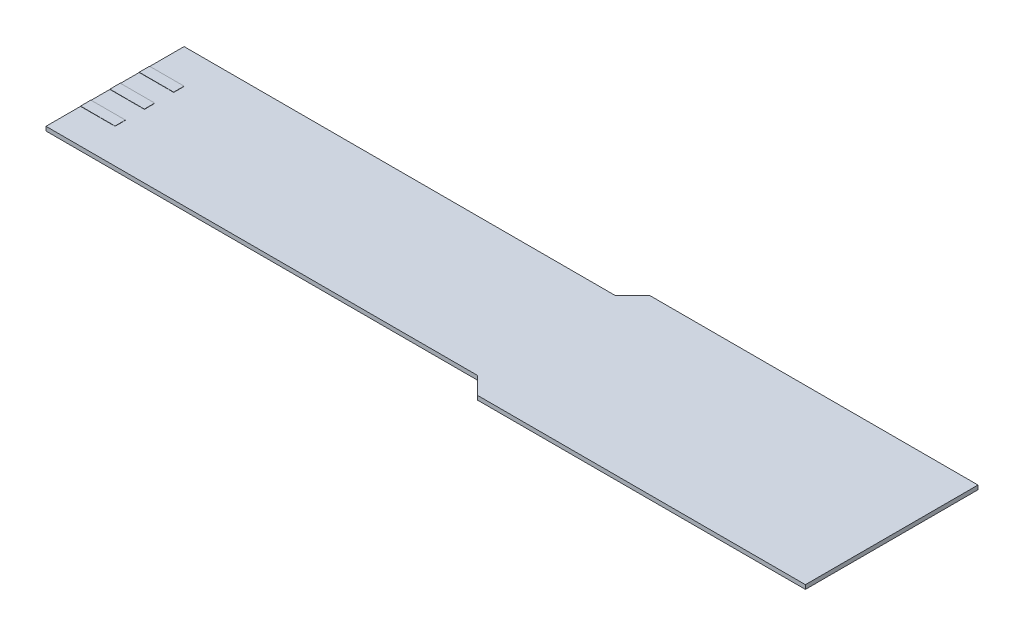
ISO-10303-21;
HEADER;
FILE_DESCRIPTION(('STEP AP214'),'2;1');
FILE_NAME('part.step','',(''),(''),'','','');
FILE_SCHEMA(('AUTOMOTIVE_DESIGN { 1 0 10303 214 1 1 1 1 }'));
ENDSEC;
DATA;
#1=APPLICATION_CONTEXT('core data for automotive mechanical design processes');
#2=APPLICATION_PROTOCOL_DEFINITION('international standard','automotive_design',2000,#1);
#3=PRODUCT_CONTEXT('',#1,'mechanical');
#4=PRODUCT('Part','Part','',(#3));
#5=PRODUCT_RELATED_PRODUCT_CATEGORY('part','',(#4));
#6=PRODUCT_DEFINITION_FORMATION('','',#4);
#7=PRODUCT_DEFINITION_CONTEXT('part definition',#1,'design');
#8=PRODUCT_DEFINITION('design','',#6,#7);
#9=PRODUCT_DEFINITION_SHAPE('','',#8);
#10=(LENGTH_UNIT() NAMED_UNIT(*) SI_UNIT(.MILLI.,.METRE.));
#11=(NAMED_UNIT(*) PLANE_ANGLE_UNIT() SI_UNIT($,.RADIAN.));
#12=(NAMED_UNIT(*) SI_UNIT($,.STERADIAN.) SOLID_ANGLE_UNIT());
#13=UNCERTAINTY_MEASURE_WITH_UNIT(LENGTH_MEASURE(1.E-05),#10,'distance_accuracy_value','');
#14=(GEOMETRIC_REPRESENTATION_CONTEXT(3) GLOBAL_UNCERTAINTY_ASSIGNED_CONTEXT((#13)) GLOBAL_UNIT_ASSIGNED_CONTEXT((#10,
#11,#12)) REPRESENTATION_CONTEXT('',''));
#15=CARTESIAN_POINT('',(0.,0.,0.));
#16=DIRECTION('',(0.,0.,1.));
#17=DIRECTION('',(1.,0.,0.));
#18=AXIS2_PLACEMENT_3D('',#15,#16,#17);
#19=CARTESIAN_POINT('',(0.,-0.265,5.));
#20=DIRECTION('',(0.,0.,1.));
#21=DIRECTION('',(1.,0.,0.));
#22=AXIS2_PLACEMENT_3D('',#19,#20,#21);
#23=PLANE('',#22);
#24=DIRECTION('',(1.,0.,0.));
#25=VECTOR('',#24,1.);
#26=CARTESIAN_POINT('',(0.,0.035,5.));
#27=LINE('',#26,#25);
#28=CARTESIAN_POINT('',(0.,0.035,5.));
#29=VERTEX_POINT('',#28);
#30=CARTESIAN_POINT('',(5.00000000000004,0.035,5.));
#31=VERTEX_POINT('',#30);
#32=EDGE_CURVE('E107',#29,#31,#27,.T.);
#33=ORIENTED_EDGE('',*,*,#32,.F.);
#34=DIRECTION('',(0.,1.,0.));
#35=VECTOR('',#34,1.);
#36=CARTESIAN_POINT('',(0.,-0.265,5.));
#37=LINE('',#36,#35);
#38=CARTESIAN_POINT('',(0.,-0.265,5.));
#39=VERTEX_POINT('',#38);
#40=EDGE_CURVE('E12',#39,#29,#37,.T.);
#41=ORIENTED_EDGE('',*,*,#40,.F.);
#42=DIRECTION('',(1.,0.,0.));
#43=VECTOR('',#42,1.);
#44=CARTESIAN_POINT('',(0.,-0.265,5.));
#45=LINE('',#44,#43);
#46=CARTESIAN_POINT('',(5.00000000000004,-0.265,5.));
#47=VERTEX_POINT('',#46);
#48=EDGE_CURVE('E101',#39,#47,#45,.T.);
#49=ORIENTED_EDGE('',*,*,#48,.T.);
#50=DIRECTION('',(0.,1.,0.));
#51=VECTOR('',#50,1.);
#52=CARTESIAN_POINT('',(5.00000000000004,-0.265,5.));
#53=LINE('',#52,#51);
#54=EDGE_CURVE('E46',#47,#31,#53,.T.);
#55=ORIENTED_EDGE('',*,*,#54,.T.);
#56=EDGE_LOOP('',(#33,#41,#49,#55));
#57=FACE_BOUND('',#56,.T.);
#58=ADVANCED_FACE('F43',(#57),#23,.T.);
#59=CARTESIAN_POINT('',(0.,-0.265,5.));
#60=DIRECTION('',(-1.,0.,0.));
#61=DIRECTION('',(0.,0.,1.));
#62=AXIS2_PLACEMENT_3D('',#59,#60,#61);
#63=PLANE('',#62);
#64=DIRECTION('',(0.,0.,1.));
#65=VECTOR('',#64,1.);
#66=CARTESIAN_POINT('',(0.,0.035,5.));
#67=LINE('',#66,#65);
#68=CARTESIAN_POINT('',(0.,0.035,3.5));
#69=VERTEX_POINT('',#68);
#70=EDGE_CURVE('E103',#69,#29,#67,.T.);
#71=ORIENTED_EDGE('',*,*,#70,.F.);
#72=DIRECTION('',(0.,1.,0.));
#73=VECTOR('',#72,1.);
#74=CARTESIAN_POINT('',(0.,-0.265,3.5));
#75=LINE('',#74,#73);
#76=CARTESIAN_POINT('',(0.,-0.265,3.5));
#77=VERTEX_POINT('',#76);
#78=EDGE_CURVE('E52',#77,#69,#75,.T.);
#79=ORIENTED_EDGE('',*,*,#78,.F.);
#80=DIRECTION('',(0.,0.,1.));
#81=VECTOR('',#80,1.);
#82=CARTESIAN_POINT('',(0.,-0.265,5.));
#83=LINE('',#82,#81);
#84=EDGE_CURVE('E98',#77,#39,#83,.T.);
#85=ORIENTED_EDGE('',*,*,#84,.T.);
#86=ORIENTED_EDGE('',*,*,#40,.T.);
#87=EDGE_LOOP('',(#71,#79,#85,#86));
#88=FACE_BOUND('',#87,.T.);
#89=ADVANCED_FACE('F117',(#88),#63,.T.);
#90=CARTESIAN_POINT('',(0.,-0.265,3.5));
#91=DIRECTION('',(0.,0.,-1.));
#92=DIRECTION('',(-1.,0.,0.));
#93=AXIS2_PLACEMENT_3D('',#90,#91,#92);
#94=PLANE('',#93);
#95=DIRECTION('',(-1.,0.,0.));
#96=VECTOR('',#95,1.);
#97=CARTESIAN_POINT('',(0.,0.035,3.5));
#98=LINE('',#97,#96);
#99=CARTESIAN_POINT('',(5.00000000000004,0.035,3.5));
#100=VERTEX_POINT('',#99);
#101=EDGE_CURVE('E93',#100,#69,#98,.T.);
#102=ORIENTED_EDGE('',*,*,#101,.F.);
#103=DIRECTION('',(0.,1.,0.));
#104=VECTOR('',#103,1.);
#105=CARTESIAN_POINT('',(5.00000000000004,-0.265,3.5));
#106=LINE('',#105,#104);
#107=CARTESIAN_POINT('',(5.00000000000004,-0.265,3.5));
#108=VERTEX_POINT('',#107);
#109=EDGE_CURVE('E88',#108,#100,#106,.T.);
#110=ORIENTED_EDGE('',*,*,#109,.F.);
#111=DIRECTION('',(-1.,0.,0.));
#112=VECTOR('',#111,1.);
#113=CARTESIAN_POINT('',(0.,-0.265,3.5));
#114=LINE('',#113,#112);
#115=EDGE_CURVE('E91',#108,#77,#114,.T.);
#116=ORIENTED_EDGE('',*,*,#115,.T.);
#117=ORIENTED_EDGE('',*,*,#78,.T.);
#118=EDGE_LOOP('',(#102,#110,#116,#117));
#119=FACE_BOUND('',#118,.T.);
#120=ADVANCED_FACE('F90',(#119),#94,.T.);
#121=CARTESIAN_POINT('',(5.00000000000004,-0.265,5.));
#122=DIRECTION('',(1.,0.,0.));
#123=DIRECTION('',(0.,0.,-1.));
#124=AXIS2_PLACEMENT_3D('',#121,#122,#123);
#125=PLANE('',#124);
#126=DIRECTION('',(0.,0.,-1.));
#127=VECTOR('',#126,1.);
#128=CARTESIAN_POINT('',(5.00000000000004,0.035,5.));
#129=LINE('',#128,#127);
#130=EDGE_CURVE('E110',#31,#100,#129,.T.);
#131=ORIENTED_EDGE('',*,*,#130,.F.);
#132=ORIENTED_EDGE('',*,*,#54,.F.);
#133=DIRECTION('',(0.,0.,-1.));
#134=VECTOR('',#133,1.);
#135=CARTESIAN_POINT('',(5.00000000000004,-0.265,5.));
#136=LINE('',#135,#134);
#137=EDGE_CURVE('E97',#47,#108,#136,.T.);
#138=ORIENTED_EDGE('',*,*,#137,.T.);
#139=ORIENTED_EDGE('',*,*,#109,.T.);
#140=EDGE_LOOP('',(#131,#132,#138,#139));
#141=FACE_BOUND('',#140,.T.);
#142=ADVANCED_FACE('F100',(#141),#125,.T.);
#143=CARTESIAN_POINT('',(0.,-0.265,0.));
#144=DIRECTION('',(0.,1.,0.));
#145=DIRECTION('',(0.,0.,1.));
#146=AXIS2_PLACEMENT_3D('',#143,#144,#145);
#147=PLANE('',#146);
#148=ORIENTED_EDGE('',*,*,#48,.F.);
#149=ORIENTED_EDGE('',*,*,#84,.F.);
#150=ORIENTED_EDGE('',*,*,#115,.F.);
#151=ORIENTED_EDGE('',*,*,#137,.F.);
#152=EDGE_LOOP('',(#148,#149,#150,#151));
#153=FACE_BOUND('',#152,.T.);
#154=ADVANCED_FACE('F96',(#153),#147,.F.);
#155=CARTESIAN_POINT('',(0.,0.035,0.));
#156=DIRECTION('',(0.,1.,0.));
#157=DIRECTION('',(0.,0.,1.));
#158=AXIS2_PLACEMENT_3D('',#155,#156,#157);
#159=PLANE('',#158);
#160=ORIENTED_EDGE('',*,*,#32,.T.);
#161=ORIENTED_EDGE('',*,*,#130,.T.);
#162=ORIENTED_EDGE('',*,*,#101,.T.);
#163=ORIENTED_EDGE('',*,*,#70,.T.);
#164=EDGE_LOOP('',(#160,#161,#162,#163));
#165=FACE_BOUND('',#164,.T.);
#166=ADVANCED_FACE('F116',(#165),#159,.T.);
#167=CLOSED_SHELL('',(#58,#89,#120,#142,#154,#166));
#168=MANIFOLD_SOLID_BREP('B2',#167);
#169=CARTESIAN_POINT('',(0.,-0.265,-3.5));
#170=DIRECTION('',(0.,0.,1.));
#171=DIRECTION('',(1.,0.,0.));
#172=AXIS2_PLACEMENT_3D('',#169,#170,#171);
#173=PLANE('',#172);
#174=DIRECTION('',(1.,0.,0.));
#175=VECTOR('',#174,1.);
#176=CARTESIAN_POINT('',(0.,0.035,-3.5));
#177=LINE('',#176,#175);
#178=CARTESIAN_POINT('',(0.,0.035,-3.5));
#179=VERTEX_POINT('',#178);
#180=CARTESIAN_POINT('',(4.99999999999999,0.035,-3.5));
#181=VERTEX_POINT('',#180);
#182=EDGE_CURVE('E240',#179,#181,#177,.T.);
#183=ORIENTED_EDGE('',*,*,#182,.F.);
#184=DIRECTION('',(0.,1.,0.));
#185=VECTOR('',#184,1.);
#186=CARTESIAN_POINT('',(0.,-0.265,-3.5));
#187=LINE('',#186,#185);
#188=CARTESIAN_POINT('',(0.,-0.265,-3.5));
#189=VERTEX_POINT('',#188);
#190=EDGE_CURVE('E41',#189,#179,#187,.T.);
#191=ORIENTED_EDGE('',*,*,#190,.F.);
#192=DIRECTION('',(1.,0.,0.));
#193=VECTOR('',#192,1.);
#194=CARTESIAN_POINT('',(0.,-0.265,-3.5));
#195=LINE('',#194,#193);
#196=CARTESIAN_POINT('',(4.99999999999999,-0.265,-3.5));
#197=VERTEX_POINT('',#196);
#198=EDGE_CURVE('E234',#189,#197,#195,.T.);
#199=ORIENTED_EDGE('',*,*,#198,.T.);
#200=DIRECTION('',(0.,1.,0.));
#201=VECTOR('',#200,1.);
#202=CARTESIAN_POINT('',(4.99999999999999,-0.265,-3.5));
#203=LINE('',#202,#201);
#204=EDGE_CURVE('E179',#197,#181,#203,.T.);
#205=ORIENTED_EDGE('',*,*,#204,.T.);
#206=EDGE_LOOP('',(#183,#191,#199,#205));
#207=FACE_BOUND('',#206,.T.);
#208=ADVANCED_FACE('F176',(#207),#173,.T.);
#209=CARTESIAN_POINT('',(0.,-0.265,-3.5));
#210=DIRECTION('',(-1.,0.,0.));
#211=DIRECTION('',(0.,0.,1.));
#212=AXIS2_PLACEMENT_3D('',#209,#210,#211);
#213=PLANE('',#212);
#214=DIRECTION('',(0.,0.,1.));
#215=VECTOR('',#214,1.);
#216=CARTESIAN_POINT('',(0.,0.035,-3.5));
#217=LINE('',#216,#215);
#218=CARTESIAN_POINT('',(0.,0.035,-5.));
#219=VERTEX_POINT('',#218);
#220=EDGE_CURVE('E236',#219,#179,#217,.T.);
#221=ORIENTED_EDGE('',*,*,#220,.F.);
#222=DIRECTION('',(0.,1.,0.));
#223=VECTOR('',#222,1.);
#224=CARTESIAN_POINT('',(0.,-0.265,-5.));
#225=LINE('',#224,#223);
#226=CARTESIAN_POINT('',(0.,-0.265,-5.));
#227=VERTEX_POINT('',#226);
#228=EDGE_CURVE('E185',#227,#219,#225,.T.);
#229=ORIENTED_EDGE('',*,*,#228,.F.);
#230=DIRECTION('',(0.,0.,1.));
#231=VECTOR('',#230,1.);
#232=CARTESIAN_POINT('',(0.,-0.265,-3.5));
#233=LINE('',#232,#231);
#234=EDGE_CURVE('E231',#227,#189,#233,.T.);
#235=ORIENTED_EDGE('',*,*,#234,.T.);
#236=ORIENTED_EDGE('',*,*,#190,.T.);
#237=EDGE_LOOP('',(#221,#229,#235,#236));
#238=FACE_BOUND('',#237,.T.);
#239=ADVANCED_FACE('F250',(#238),#213,.T.);
#240=CARTESIAN_POINT('',(0.,-0.265,-5.));
#241=DIRECTION('',(0.,0.,-1.));
#242=DIRECTION('',(-1.,0.,0.));
#243=AXIS2_PLACEMENT_3D('',#240,#241,#242);
#244=PLANE('',#243);
#245=DIRECTION('',(-1.,0.,0.));
#246=VECTOR('',#245,1.);
#247=CARTESIAN_POINT('',(0.,0.035,-5.));
#248=LINE('',#247,#246);
#249=CARTESIAN_POINT('',(4.99999999999999,0.035,-5.));
#250=VERTEX_POINT('',#249);
#251=EDGE_CURVE('E226',#250,#219,#248,.T.);
#252=ORIENTED_EDGE('',*,*,#251,.F.);
#253=DIRECTION('',(0.,1.,0.));
#254=VECTOR('',#253,1.);
#255=CARTESIAN_POINT('',(4.99999999999999,-0.265,-5.));
#256=LINE('',#255,#254);
#257=CARTESIAN_POINT('',(4.99999999999999,-0.265,-5.));
#258=VERTEX_POINT('',#257);
#259=EDGE_CURVE('E221',#258,#250,#256,.T.);
#260=ORIENTED_EDGE('',*,*,#259,.F.);
#261=DIRECTION('',(-1.,0.,0.));
#262=VECTOR('',#261,1.);
#263=CARTESIAN_POINT('',(0.,-0.265,-5.));
#264=LINE('',#263,#262);
#265=EDGE_CURVE('E224',#258,#227,#264,.T.);
#266=ORIENTED_EDGE('',*,*,#265,.T.);
#267=ORIENTED_EDGE('',*,*,#228,.T.);
#268=EDGE_LOOP('',(#252,#260,#266,#267));
#269=FACE_BOUND('',#268,.T.);
#270=ADVANCED_FACE('F223',(#269),#244,.T.);
#271=CARTESIAN_POINT('',(4.99999999999999,-0.265,-3.5));
#272=DIRECTION('',(1.,0.,0.));
#273=DIRECTION('',(0.,0.,-1.));
#274=AXIS2_PLACEMENT_3D('',#271,#272,#273);
#275=PLANE('',#274);
#276=DIRECTION('',(0.,0.,-1.));
#277=VECTOR('',#276,1.);
#278=CARTESIAN_POINT('',(4.99999999999999,0.035,-3.5));
#279=LINE('',#278,#277);
#280=EDGE_CURVE('E243',#181,#250,#279,.T.);
#281=ORIENTED_EDGE('',*,*,#280,.F.);
#282=ORIENTED_EDGE('',*,*,#204,.F.);
#283=DIRECTION('',(0.,0.,-1.));
#284=VECTOR('',#283,1.);
#285=CARTESIAN_POINT('',(4.99999999999999,-0.265,-3.5));
#286=LINE('',#285,#284);
#287=EDGE_CURVE('E230',#197,#258,#286,.T.);
#288=ORIENTED_EDGE('',*,*,#287,.T.);
#289=ORIENTED_EDGE('',*,*,#259,.T.);
#290=EDGE_LOOP('',(#281,#282,#288,#289));
#291=FACE_BOUND('',#290,.T.);
#292=ADVANCED_FACE('F233',(#291),#275,.T.);
#293=CARTESIAN_POINT('',(0.,-0.265,0.));
#294=DIRECTION('',(0.,1.,0.));
#295=DIRECTION('',(0.,0.,1.));
#296=AXIS2_PLACEMENT_3D('',#293,#294,#295);
#297=PLANE('',#296);
#298=ORIENTED_EDGE('',*,*,#198,.F.);
#299=ORIENTED_EDGE('',*,*,#234,.F.);
#300=ORIENTED_EDGE('',*,*,#265,.F.);
#301=ORIENTED_EDGE('',*,*,#287,.F.);
#302=EDGE_LOOP('',(#298,#299,#300,#301));
#303=FACE_BOUND('',#302,.T.);
#304=ADVANCED_FACE('F229',(#303),#297,.F.);
#305=CARTESIAN_POINT('',(0.,0.035,0.));
#306=DIRECTION('',(0.,1.,0.));
#307=DIRECTION('',(0.,0.,1.));
#308=AXIS2_PLACEMENT_3D('',#305,#306,#307);
#309=PLANE('',#308);
#310=ORIENTED_EDGE('',*,*,#182,.T.);
#311=ORIENTED_EDGE('',*,*,#280,.T.);
#312=ORIENTED_EDGE('',*,*,#251,.T.);
#313=ORIENTED_EDGE('',*,*,#220,.T.);
#314=EDGE_LOOP('',(#310,#311,#312,#313));
#315=FACE_BOUND('',#314,.T.);
#316=ADVANCED_FACE('F249',(#315),#309,.T.);
#317=CLOSED_SHELL('',(#208,#239,#270,#292,#304,#316));
#318=MANIFOLD_SOLID_BREP('B6',#317);
#319=CARTESIAN_POINT('',(0.,-0.265,0.750000000000001));
#320=DIRECTION('',(-1.,0.,0.));
#321=DIRECTION('',(0.,0.,1.));
#322=AXIS2_PLACEMENT_3D('',#319,#320,#321);
#323=PLANE('',#322);
#324=DIRECTION('',(0.,0.,1.));
#325=VECTOR('',#324,1.);
#326=CARTESIAN_POINT('',(0.,0.035,0.750000000000001));
#327=LINE('',#326,#325);
#328=CARTESIAN_POINT('',(0.,0.035,-0.75));
#329=VERTEX_POINT('',#328);
#330=CARTESIAN_POINT('',(0.,0.035,0.750000000000001));
#331=VERTEX_POINT('',#330);
#332=EDGE_CURVE('E372',#329,#331,#327,.T.);
#333=ORIENTED_EDGE('',*,*,#332,.F.);
#334=DIRECTION('',(0.,1.,0.));
#335=VECTOR('',#334,1.);
#336=CARTESIAN_POINT('',(0.,-0.265,-0.75));
#337=LINE('',#336,#335);
#338=CARTESIAN_POINT('',(0.,-0.265,-0.75));
#339=VERTEX_POINT('',#338);
#340=EDGE_CURVE('E174',#339,#329,#337,.T.);
#341=ORIENTED_EDGE('',*,*,#340,.F.);
#342=DIRECTION('',(0.,0.,1.));
#343=VECTOR('',#342,1.);
#344=CARTESIAN_POINT('',(0.,-0.265,0.750000000000001));
#345=LINE('',#344,#343);
#346=CARTESIAN_POINT('',(0.,-0.265,0.750000000000001));
#347=VERTEX_POINT('',#346);
#348=EDGE_CURVE('E366',#339,#347,#345,.T.);
#349=ORIENTED_EDGE('',*,*,#348,.T.);
#350=DIRECTION('',(0.,1.,0.));
#351=VECTOR('',#350,1.);
#352=CARTESIAN_POINT('',(0.,-0.265,0.750000000000001));
#353=LINE('',#352,#351);
#354=EDGE_CURVE('E311',#347,#331,#353,.T.);
#355=ORIENTED_EDGE('',*,*,#354,.T.);
#356=EDGE_LOOP('',(#333,#341,#349,#355));
#357=FACE_BOUND('',#356,.T.);
#358=ADVANCED_FACE('F308',(#357),#323,.T.);
#359=CARTESIAN_POINT('',(0.,-0.265,-0.75));
#360=DIRECTION('',(0.,0.,-1.));
#361=DIRECTION('',(-1.,0.,0.));
#362=AXIS2_PLACEMENT_3D('',#359,#360,#361);
#363=PLANE('',#362);
#364=DIRECTION('',(-1.,0.,0.));
#365=VECTOR('',#364,1.);
#366=CARTESIAN_POINT('',(0.,0.035,-0.75));
#367=LINE('',#366,#365);
#368=CARTESIAN_POINT('',(5.,0.035,-0.75));
#369=VERTEX_POINT('',#368);
#370=EDGE_CURVE('E368',#369,#329,#367,.T.);
#371=ORIENTED_EDGE('',*,*,#370,.F.);
#372=DIRECTION('',(0.,1.,0.));
#373=VECTOR('',#372,1.);
#374=CARTESIAN_POINT('',(5.,-0.265,-0.75));
#375=LINE('',#374,#373);
#376=CARTESIAN_POINT('',(5.,-0.265,-0.75));
#377=VERTEX_POINT('',#376);
#378=EDGE_CURVE('E317',#377,#369,#375,.T.);
#379=ORIENTED_EDGE('',*,*,#378,.F.);
#380=DIRECTION('',(-1.,0.,0.));
#381=VECTOR('',#380,1.);
#382=CARTESIAN_POINT('',(0.,-0.265,-0.75));
#383=LINE('',#382,#381);
#384=EDGE_CURVE('E363',#377,#339,#383,.T.);
#385=ORIENTED_EDGE('',*,*,#384,.T.);
#386=ORIENTED_EDGE('',*,*,#340,.T.);
#387=EDGE_LOOP('',(#371,#379,#385,#386));
#388=FACE_BOUND('',#387,.T.);
#389=ADVANCED_FACE('F382',(#388),#363,.T.);
#390=CARTESIAN_POINT('',(5.,-0.265,0.75));
#391=DIRECTION('',(1.,0.,0.));
#392=DIRECTION('',(0.,0.,-1.));
#393=AXIS2_PLACEMENT_3D('',#390,#391,#392);
#394=PLANE('',#393);
#395=DIRECTION('',(0.,0.,-1.));
#396=VECTOR('',#395,1.);
#397=CARTESIAN_POINT('',(5.,0.035,0.75));
#398=LINE('',#397,#396);
#399=CARTESIAN_POINT('',(5.,0.035,0.75));
#400=VERTEX_POINT('',#399);
#401=EDGE_CURVE('E358',#400,#369,#398,.T.);
#402=ORIENTED_EDGE('',*,*,#401,.F.);
#403=DIRECTION('',(0.,1.,0.));
#404=VECTOR('',#403,1.);
#405=CARTESIAN_POINT('',(5.,-0.265,0.75));
#406=LINE('',#405,#404);
#407=CARTESIAN_POINT('',(5.,-0.265,0.75));
#408=VERTEX_POINT('',#407);
#409=EDGE_CURVE('E353',#408,#400,#406,.T.);
#410=ORIENTED_EDGE('',*,*,#409,.F.);
#411=DIRECTION('',(0.,0.,-1.));
#412=VECTOR('',#411,1.);
#413=CARTESIAN_POINT('',(5.,-0.265,0.75));
#414=LINE('',#413,#412);
#415=EDGE_CURVE('E356',#408,#377,#414,.T.);
#416=ORIENTED_EDGE('',*,*,#415,.T.);
#417=ORIENTED_EDGE('',*,*,#378,.T.);
#418=EDGE_LOOP('',(#402,#410,#416,#417));
#419=FACE_BOUND('',#418,.T.);
#420=ADVANCED_FACE('F355',(#419),#394,.T.);
#421=CARTESIAN_POINT('',(0.,-0.265,0.750000000000001));
#422=DIRECTION('',(0.,0.,1.));
#423=DIRECTION('',(1.,0.,0.));
#424=AXIS2_PLACEMENT_3D('',#421,#422,#423);
#425=PLANE('',#424);
#426=DIRECTION('',(1.,0.,0.));
#427=VECTOR('',#426,1.);
#428=CARTESIAN_POINT('',(0.,0.035,0.750000000000001));
#429=LINE('',#428,#427);
#430=EDGE_CURVE('E375',#331,#400,#429,.T.);
#431=ORIENTED_EDGE('',*,*,#430,.F.);
#432=ORIENTED_EDGE('',*,*,#354,.F.);
#433=DIRECTION('',(1.,0.,0.));
#434=VECTOR('',#433,1.);
#435=CARTESIAN_POINT('',(0.,-0.265,0.750000000000001));
#436=LINE('',#435,#434);
#437=EDGE_CURVE('E362',#347,#408,#436,.T.);
#438=ORIENTED_EDGE('',*,*,#437,.T.);
#439=ORIENTED_EDGE('',*,*,#409,.T.);
#440=EDGE_LOOP('',(#431,#432,#438,#439));
#441=FACE_BOUND('',#440,.T.);
#442=ADVANCED_FACE('F365',(#441),#425,.T.);
#443=CARTESIAN_POINT('',(0.,-0.265,0.));
#444=DIRECTION('',(0.,-1.,0.));
#445=DIRECTION('',(0.,0.,-1.));
#446=AXIS2_PLACEMENT_3D('',#443,#444,#445);
#447=PLANE('',#446);
#448=ORIENTED_EDGE('',*,*,#348,.F.);
#449=ORIENTED_EDGE('',*,*,#384,.F.);
#450=ORIENTED_EDGE('',*,*,#415,.F.);
#451=ORIENTED_EDGE('',*,*,#437,.F.);
#452=EDGE_LOOP('',(#448,#449,#450,#451));
#453=FACE_BOUND('',#452,.T.);
#454=ADVANCED_FACE('F361',(#453),#447,.T.);
#455=CARTESIAN_POINT('',(0.,0.035,0.));
#456=DIRECTION('',(0.,-1.,0.));
#457=DIRECTION('',(0.,0.,-1.));
#458=AXIS2_PLACEMENT_3D('',#455,#456,#457);
#459=PLANE('',#458);
#460=ORIENTED_EDGE('',*,*,#332,.T.);
#461=ORIENTED_EDGE('',*,*,#430,.T.);
#462=ORIENTED_EDGE('',*,*,#401,.T.);
#463=ORIENTED_EDGE('',*,*,#370,.T.);
#464=EDGE_LOOP('',(#460,#461,#462,#463));
#465=FACE_BOUND('',#464,.T.);
#466=ADVANCED_FACE('F381',(#465),#459,.F.);
#467=CLOSED_SHELL('',(#358,#389,#420,#442,#454,#466));
#468=MANIFOLD_SOLID_BREP('B35',#467);
#469=CARTESIAN_POINT('',(0.,0.,10.));
#470=DIRECTION('',(0.,0.,-1.));
#471=DIRECTION('',(-1.,0.,0.));
#472=AXIS2_PLACEMENT_3D('',#469,#470,#471);
#473=PLANE('',#472);
#474=DIRECTION('',(1.,0.,0.));
#475=VECTOR('',#474,1.);
#476=CARTESIAN_POINT('',(0.,-0.6,10.));
#477=LINE('',#476,#475);
#478=CARTESIAN_POINT('',(0.,-0.6,10.));
#479=VERTEX_POINT('',#478);
#480=CARTESIAN_POINT('',(62.5,-0.6,10.));
#481=VERTEX_POINT('',#480);
#482=EDGE_CURVE('E528',#479,#481,#477,.T.);
#483=ORIENTED_EDGE('',*,*,#482,.T.);
#484=DIRECTION('',(0.,-1.,0.));
#485=VECTOR('',#484,1.);
#486=CARTESIAN_POINT('',(62.5,0.,10.));
#487=LINE('',#486,#485);
#488=CARTESIAN_POINT('',(62.5,0.,10.));
#489=VERTEX_POINT('',#488);
#490=EDGE_CURVE('E306',#489,#481,#487,.T.);
#491=ORIENTED_EDGE('',*,*,#490,.F.);
#492=DIRECTION('',(1.,0.,0.));
#493=VECTOR('',#492,1.);
#494=CARTESIAN_POINT('',(0.,0.,10.));
#495=LINE('',#494,#493);
#496=CARTESIAN_POINT('',(0.,0.,10.));
#497=VERTEX_POINT('',#496);
#498=EDGE_CURVE('E547',#497,#489,#495,.T.);
#499=ORIENTED_EDGE('',*,*,#498,.F.);
#500=DIRECTION('',(0.,-1.,0.));
#501=VECTOR('',#500,1.);
#502=CARTESIAN_POINT('',(0.,0.,10.));
#503=LINE('',#502,#501);
#504=EDGE_CURVE('E447',#497,#479,#503,.T.);
#505=ORIENTED_EDGE('',*,*,#504,.T.);
#506=EDGE_LOOP('',(#483,#491,#499,#505));
#507=FACE_BOUND('',#506,.T.);
#508=ADVANCED_FACE('F431',(#507),#473,.F.);
#509=CARTESIAN_POINT('',(26.25,0.,-26.25));
#510=DIRECTION('',(0.707106781186547,0.,-0.707106781186548));
#511=DIRECTION('',(-0.707106781186548,0.,-0.707106781186547));
#512=AXIS2_PLACEMENT_3D('',#509,#510,#511);
#513=PLANE('',#512);
#514=DIRECTION('',(0.707106781186548,0.,0.707106781186547));
#515=VECTOR('',#514,1.);
#516=CARTESIAN_POINT('',(26.25,-0.6,-26.25));
#517=LINE('',#516,#515);
#518=CARTESIAN_POINT('',(65.,-0.6,12.5));
#519=VERTEX_POINT('',#518);
#520=EDGE_CURVE('E530',#481,#519,#517,.T.);
#521=ORIENTED_EDGE('',*,*,#520,.T.);
#522=DIRECTION('',(0.,-1.,0.));
#523=VECTOR('',#522,1.);
#524=CARTESIAN_POINT('',(65.,0.,12.5));
#525=LINE('',#524,#523);
#526=CARTESIAN_POINT('',(65.,0.,12.5));
#527=VERTEX_POINT('',#526);
#528=EDGE_CURVE('E439',#527,#519,#525,.T.);
#529=ORIENTED_EDGE('',*,*,#528,.F.);
#530=DIRECTION('',(0.707106781186548,0.,0.707106781186547));
#531=VECTOR('',#530,1.);
#532=CARTESIAN_POINT('',(26.25,0.,-26.25));
#533=LINE('',#532,#531);
#534=EDGE_CURVE('E485',#489,#527,#533,.T.);
#535=ORIENTED_EDGE('',*,*,#534,.F.);
#536=ORIENTED_EDGE('',*,*,#490,.T.);
#537=EDGE_LOOP('',(#521,#529,#535,#536));
#538=FACE_BOUND('',#537,.T.);
#539=ADVANCED_FACE('F574',(#538),#513,.F.);
#540=CARTESIAN_POINT('',(0.,0.,12.5));
#541=DIRECTION('',(0.,0.,-1.));
#542=DIRECTION('',(-1.,0.,0.));
#543=AXIS2_PLACEMENT_3D('',#540,#541,#542);
#544=PLANE('',#543);
#545=DIRECTION('',(1.,0.,0.));
#546=VECTOR('',#545,1.);
#547=CARTESIAN_POINT('',(0.,-0.6,12.5));
#548=LINE('',#547,#546);
#549=CARTESIAN_POINT('',(112.5,-0.6,12.5));
#550=VERTEX_POINT('',#549);
#551=EDGE_CURVE('E532',#519,#550,#548,.T.);
#552=ORIENTED_EDGE('',*,*,#551,.T.);
#553=DIRECTION('',(0.,-1.,0.));
#554=VECTOR('',#553,1.);
#555=CARTESIAN_POINT('',(112.5,0.,12.5));
#556=LINE('',#555,#554);
#557=CARTESIAN_POINT('',(112.5,0.,12.5));
#558=VERTEX_POINT('',#557);
#559=EDGE_CURVE('E553',#558,#550,#556,.T.);
#560=ORIENTED_EDGE('',*,*,#559,.F.);
#561=DIRECTION('',(1.,0.,0.));
#562=VECTOR('',#561,1.);
#563=CARTESIAN_POINT('',(0.,0.,12.5));
#564=LINE('',#563,#562);
#565=EDGE_CURVE('E560',#527,#558,#564,.T.);
#566=ORIENTED_EDGE('',*,*,#565,.F.);
#567=ORIENTED_EDGE('',*,*,#528,.T.);
#568=EDGE_LOOP('',(#552,#560,#566,#567));
#569=FACE_BOUND('',#568,.T.);
#570=ADVANCED_FACE('F558',(#569),#544,.F.);
#571=CARTESIAN_POINT('',(112.5,0.,0.));
#572=DIRECTION('',(1.,0.,0.));
#573=DIRECTION('',(0.,0.,-1.));
#574=AXIS2_PLACEMENT_3D('',#571,#572,#573);
#575=PLANE('',#574);
#576=DIRECTION('',(0.,0.,1.));
#577=VECTOR('',#576,1.);
#578=CARTESIAN_POINT('',(112.5,-0.6,0.));
#579=LINE('',#578,#577);
#580=CARTESIAN_POINT('',(112.5,-0.6,-12.5));
#581=VERTEX_POINT('',#580);
#582=EDGE_CURVE('E535',#581,#550,#579,.T.);
#583=ORIENTED_EDGE('',*,*,#582,.F.);
#584=DIRECTION('',(0.,-1.,0.));
#585=VECTOR('',#584,1.);
#586=CARTESIAN_POINT('',(112.5,0.,-12.5));
#587=LINE('',#586,#585);
#588=CARTESIAN_POINT('',(112.5,0.,-12.5));
#589=VERTEX_POINT('',#588);
#590=EDGE_CURVE('E551',#589,#581,#587,.T.);
#591=ORIENTED_EDGE('',*,*,#590,.F.);
#592=DIRECTION('',(0.,0.,1.));
#593=VECTOR('',#592,1.);
#594=CARTESIAN_POINT('',(112.5,0.,0.));
#595=LINE('',#594,#593);
#596=EDGE_CURVE('E568',#589,#558,#595,.T.);
#597=ORIENTED_EDGE('',*,*,#596,.T.);
#598=ORIENTED_EDGE('',*,*,#559,.T.);
#599=EDGE_LOOP('',(#583,#591,#597,#598));
#600=FACE_BOUND('',#599,.T.);
#601=ADVANCED_FACE('F566',(#600),#575,.T.);
#602=CARTESIAN_POINT('',(0.,0.,-12.5));
#603=DIRECTION('',(0.,0.,-1.));
#604=DIRECTION('',(-1.,0.,0.));
#605=AXIS2_PLACEMENT_3D('',#602,#603,#604);
#606=PLANE('',#605);
#607=DIRECTION('',(1.,0.,0.));
#608=VECTOR('',#607,1.);
#609=CARTESIAN_POINT('',(0.,-0.6,-12.5));
#610=LINE('',#609,#608);
#611=CARTESIAN_POINT('',(65.,-0.6,-12.5));
#612=VERTEX_POINT('',#611);
#613=EDGE_CURVE('E538',#612,#581,#610,.T.);
#614=ORIENTED_EDGE('',*,*,#613,.F.);
#615=DIRECTION('',(0.,-1.,0.));
#616=VECTOR('',#615,1.);
#617=CARTESIAN_POINT('',(65.,0.,-12.5));
#618=LINE('',#617,#616);
#619=CARTESIAN_POINT('',(65.,0.,-12.5));
#620=VERTEX_POINT('',#619);
#621=EDGE_CURVE('E510',#620,#612,#618,.T.);
#622=ORIENTED_EDGE('',*,*,#621,.F.);
#623=DIRECTION('',(1.,0.,0.));
#624=VECTOR('',#623,1.);
#625=CARTESIAN_POINT('',(0.,0.,-12.5));
#626=LINE('',#625,#624);
#627=EDGE_CURVE('E520',#620,#589,#626,.T.);
#628=ORIENTED_EDGE('',*,*,#627,.T.);
#629=ORIENTED_EDGE('',*,*,#590,.T.);
#630=EDGE_LOOP('',(#614,#622,#628,#629));
#631=FACE_BOUND('',#630,.T.);
#632=ADVANCED_FACE('F584',(#631),#606,.T.);
#633=CARTESIAN_POINT('',(26.25,0.,26.25));
#634=DIRECTION('',(-0.707106781186547,0.,-0.707106781186548));
#635=DIRECTION('',(-0.707106781186548,0.,0.707106781186547));
#636=AXIS2_PLACEMENT_3D('',#633,#634,#635);
#637=PLANE('',#636);
#638=DIRECTION('',(0.707106781186548,0.,-0.707106781186547));
#639=VECTOR('',#638,1.);
#640=CARTESIAN_POINT('',(26.25,-0.6,26.25));
#641=LINE('',#640,#639);
#642=CARTESIAN_POINT('',(62.5,-0.6,-10.));
#643=VERTEX_POINT('',#642);
#644=EDGE_CURVE('E506',#643,#612,#641,.T.);
#645=ORIENTED_EDGE('',*,*,#644,.F.);
#646=DIRECTION('',(0.,-1.,0.));
#647=VECTOR('',#646,1.);
#648=CARTESIAN_POINT('',(62.5,0.,-10.));
#649=LINE('',#648,#647);
#650=CARTESIAN_POINT('',(62.5,0.,-10.));
#651=VERTEX_POINT('',#650);
#652=EDGE_CURVE('E501',#651,#643,#649,.T.);
#653=ORIENTED_EDGE('',*,*,#652,.F.);
#654=DIRECTION('',(0.707106781186548,0.,-0.707106781186547));
#655=VECTOR('',#654,1.);
#656=CARTESIAN_POINT('',(26.25,0.,26.25));
#657=LINE('',#656,#655);
#658=EDGE_CURVE('E504',#651,#620,#657,.T.);
#659=ORIENTED_EDGE('',*,*,#658,.T.);
#660=ORIENTED_EDGE('',*,*,#621,.T.);
#661=EDGE_LOOP('',(#645,#653,#659,#660));
#662=FACE_BOUND('',#661,.T.);
#663=ADVANCED_FACE('F503',(#662),#637,.T.);
#664=CARTESIAN_POINT('',(0.,0.,-10.));
#665=DIRECTION('',(0.,0.,-1.));
#666=DIRECTION('',(-1.,0.,0.));
#667=AXIS2_PLACEMENT_3D('',#664,#665,#666);
#668=PLANE('',#667);
#669=DIRECTION('',(1.,0.,0.));
#670=VECTOR('',#669,1.);
#671=CARTESIAN_POINT('',(0.,-0.6,-10.));
#672=LINE('',#671,#670);
#673=CARTESIAN_POINT('',(0.,-0.6,-10.));
#674=VERTEX_POINT('',#673);
#675=EDGE_CURVE('E542',#674,#643,#672,.T.);
#676=ORIENTED_EDGE('',*,*,#675,.F.);
#677=DIRECTION('',(0.,-1.,0.));
#678=VECTOR('',#677,1.);
#679=CARTESIAN_POINT('',(0.,0.,-10.));
#680=LINE('',#679,#678);
#681=CARTESIAN_POINT('',(0.,0.,-10.));
#682=VERTEX_POINT('',#681);
#683=EDGE_CURVE('E473',#682,#674,#680,.T.);
#684=ORIENTED_EDGE('',*,*,#683,.F.);
#685=DIRECTION('',(1.,0.,0.));
#686=VECTOR('',#685,1.);
#687=CARTESIAN_POINT('',(0.,0.,-10.));
#688=LINE('',#687,#686);
#689=EDGE_CURVE('E517',#682,#651,#688,.T.);
#690=ORIENTED_EDGE('',*,*,#689,.T.);
#691=ORIENTED_EDGE('',*,*,#652,.T.);
#692=EDGE_LOOP('',(#676,#684,#690,#691));
#693=FACE_BOUND('',#692,.T.);
#694=ADVANCED_FACE('F522',(#693),#668,.T.);
#695=CARTESIAN_POINT('',(0.,0.,0.));
#696=DIRECTION('',(-1.,0.,0.));
#697=DIRECTION('',(0.,0.,1.));
#698=AXIS2_PLACEMENT_3D('',#695,#696,#697);
#699=PLANE('',#698);
#700=DIRECTION('',(0.,0.,-1.));
#701=VECTOR('',#700,1.);
#702=CARTESIAN_POINT('',(0.,-0.6,0.));
#703=LINE('',#702,#701);
#704=EDGE_CURVE('E544',#479,#674,#703,.T.);
#705=ORIENTED_EDGE('',*,*,#704,.F.);
#706=ORIENTED_EDGE('',*,*,#504,.F.);
#707=DIRECTION('',(0.,0.,-1.));
#708=VECTOR('',#707,1.);
#709=CARTESIAN_POINT('',(0.,0.,0.));
#710=LINE('',#709,#708);
#711=EDGE_CURVE('E523',#497,#682,#710,.T.);
#712=ORIENTED_EDGE('',*,*,#711,.T.);
#713=ORIENTED_EDGE('',*,*,#683,.T.);
#714=EDGE_LOOP('',(#705,#706,#712,#713));
#715=FACE_BOUND('',#714,.T.);
#716=ADVANCED_FACE('F592',(#715),#699,.T.);
#717=CARTESIAN_POINT('',(0.,0.,0.));
#718=DIRECTION('',(0.,1.,0.));
#719=DIRECTION('',(0.,0.,1.));
#720=AXIS2_PLACEMENT_3D('',#717,#718,#719);
#721=PLANE('',#720);
#722=ORIENTED_EDGE('',*,*,#498,.T.);
#723=ORIENTED_EDGE('',*,*,#534,.T.);
#724=ORIENTED_EDGE('',*,*,#565,.T.);
#725=ORIENTED_EDGE('',*,*,#596,.F.);
#726=ORIENTED_EDGE('',*,*,#627,.F.);
#727=ORIENTED_EDGE('',*,*,#658,.F.);
#728=ORIENTED_EDGE('',*,*,#689,.F.);
#729=ORIENTED_EDGE('',*,*,#711,.F.);
#730=EDGE_LOOP('',(#722,#723,#724,#725,#726,#727,#728,#729));
#731=FACE_BOUND('',#730,.T.);
#732=ADVANCED_FACE('F515',(#731),#721,.T.);
#733=CARTESIAN_POINT('',(0.,-0.6,0.));
#734=DIRECTION('',(0.,1.,0.));
#735=DIRECTION('',(0.,0.,1.));
#736=AXIS2_PLACEMENT_3D('',#733,#734,#735);
#737=PLANE('',#736);
#738=ORIENTED_EDGE('',*,*,#482,.F.);
#739=ORIENTED_EDGE('',*,*,#704,.T.);
#740=ORIENTED_EDGE('',*,*,#675,.T.);
#741=ORIENTED_EDGE('',*,*,#644,.T.);
#742=ORIENTED_EDGE('',*,*,#613,.T.);
#743=ORIENTED_EDGE('',*,*,#582,.T.);
#744=ORIENTED_EDGE('',*,*,#551,.F.);
#745=ORIENTED_EDGE('',*,*,#520,.F.);
#746=EDGE_LOOP('',(#738,#739,#740,#741,#742,#743,#744,#745));
#747=FACE_BOUND('',#746,.T.);
#748=ADVANCED_FACE('F562',(#747),#737,.F.);
#749=CLOSED_SHELL('',(#508,#539,#570,#601,#632,#663,#694,#716,#732,#748));
#750=MANIFOLD_SOLID_BREP('B168',#749);
#751=ADVANCED_BREP_SHAPE_REPRESENTATION('',(#18,#168,#318,#468,#750),#14);
#752=SHAPE_DEFINITION_REPRESENTATION(#9,#751);
ENDSEC;
END-ISO-10303-21;
